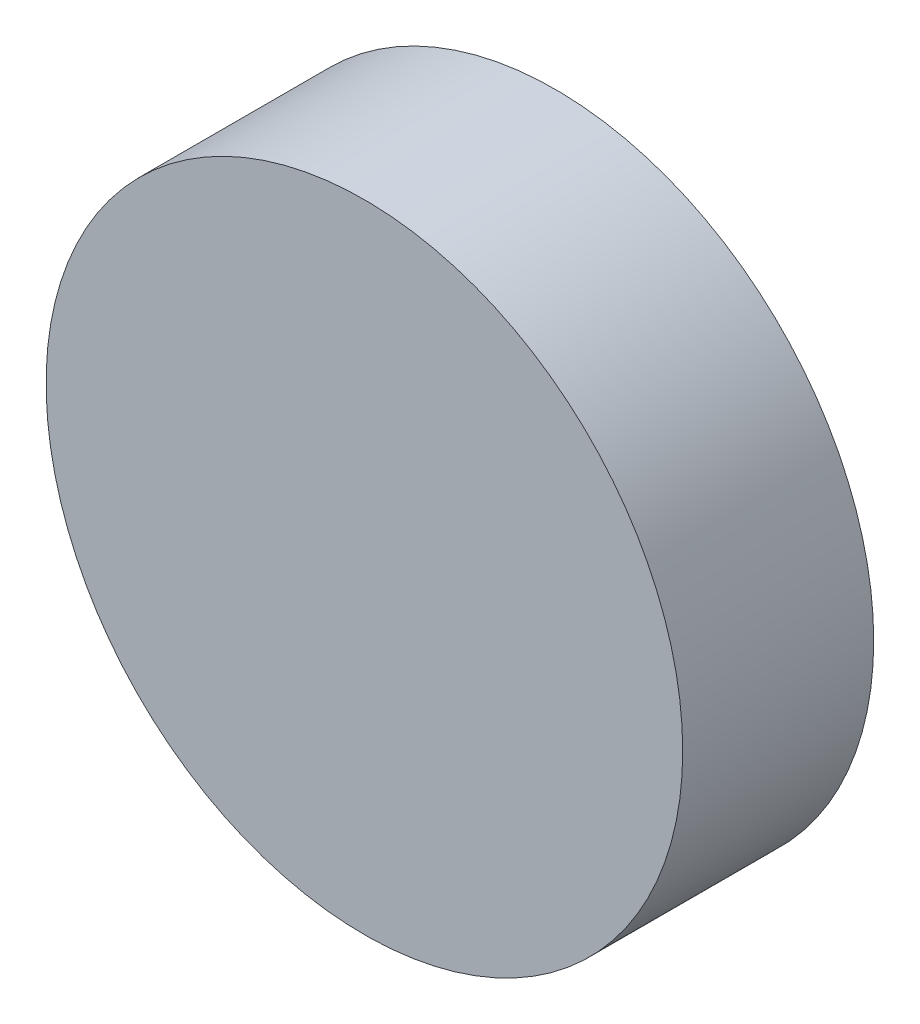
ISO-10303-21;
HEADER;
FILE_DESCRIPTION(('STEP AP214'),'2;1');
FILE_NAME('part.step','',(''),(''),'','','');
FILE_SCHEMA(('AUTOMOTIVE_DESIGN { 1 0 10303 214 1 1 1 1 }'));
ENDSEC;
DATA;
#1=APPLICATION_CONTEXT('core data for automotive mechanical design processes');
#2=APPLICATION_PROTOCOL_DEFINITION('international standard','automotive_design',2000,#1);
#3=PRODUCT_CONTEXT('',#1,'mechanical');
#4=PRODUCT('Part','Part','',(#3));
#5=PRODUCT_RELATED_PRODUCT_CATEGORY('part','',(#4));
#6=PRODUCT_DEFINITION_FORMATION('','',#4);
#7=PRODUCT_DEFINITION_CONTEXT('part definition',#1,'design');
#8=PRODUCT_DEFINITION('design','',#6,#7);
#9=PRODUCT_DEFINITION_SHAPE('','',#8);
#10=(LENGTH_UNIT() NAMED_UNIT(*) SI_UNIT(.MILLI.,.METRE.));
#11=(NAMED_UNIT(*) PLANE_ANGLE_UNIT() SI_UNIT($,.RADIAN.));
#12=(NAMED_UNIT(*) SI_UNIT($,.STERADIAN.) SOLID_ANGLE_UNIT());
#13=UNCERTAINTY_MEASURE_WITH_UNIT(LENGTH_MEASURE(1.E-05),#10,'distance_accuracy_value','');
#14=(GEOMETRIC_REPRESENTATION_CONTEXT(3) GLOBAL_UNCERTAINTY_ASSIGNED_CONTEXT((#13)) GLOBAL_UNIT_ASSIGNED_CONTEXT((#10,
#11,#12)) REPRESENTATION_CONTEXT('',''));
#15=CARTESIAN_POINT('',(0.,0.,0.));
#16=DIRECTION('',(0.,0.,1.));
#17=DIRECTION('',(1.,0.,0.));
#18=AXIS2_PLACEMENT_3D('',#15,#16,#17);
#19=CARTESIAN_POINT('',(0.,0.,28.575));
#20=DIRECTION('',(0.,0.,-1.));
#21=DIRECTION('',(-1.,0.,0.));
#22=AXIS2_PLACEMENT_3D('',#19,#20,#21);
#23=CYLINDRICAL_SURFACE('',#22,95.25);
#24=CARTESIAN_POINT('',(0.,0.,28.575));
#25=DIRECTION('',(0.,0.,1.));
#26=DIRECTION('',(1.,0.,0.));
#27=AXIS2_PLACEMENT_3D('',#24,#25,#26);
#28=CIRCLE('',#27,95.25);
#29=CARTESIAN_POINT('',(95.25,0.,28.575));
#30=VERTEX_POINT('',#29);
#31=EDGE_CURVE('E10',#30,#30,#28,.T.);
#32=ORIENTED_EDGE('',*,*,#31,.F.);
#33=EDGE_LOOP('',(#32));
#34=FACE_BOUND('',#33,.T.);
#35=CARTESIAN_POINT('',(0.,0.,-28.575));
#36=DIRECTION('',(0.,0.,1.));
#37=DIRECTION('',(1.,0.,0.));
#38=AXIS2_PLACEMENT_3D('',#35,#36,#37);
#39=CIRCLE('',#38,95.25);
#40=CARTESIAN_POINT('',(95.25,0.,-28.575));
#41=VERTEX_POINT('',#40);
#42=EDGE_CURVE('E46',#41,#41,#39,.T.);
#43=ORIENTED_EDGE('',*,*,#42,.T.);
#44=EDGE_LOOP('',(#43));
#45=FACE_BOUND('',#44,.T.);
#46=ADVANCED_FACE('F43',(#34,#45),#23,.T.);
#47=CARTESIAN_POINT('',(0.,0.,28.575));
#48=DIRECTION('',(0.,0.,1.));
#49=DIRECTION('',(1.,0.,0.));
#50=AXIS2_PLACEMENT_3D('',#47,#48,#49);
#51=PLANE('',#50);
#52=ORIENTED_EDGE('',*,*,#31,.T.);
#53=EDGE_LOOP('',(#52));
#54=FACE_BOUND('',#53,.T.);
#55=ADVANCED_FACE('F60',(#54),#51,.T.);
#56=CARTESIAN_POINT('',(0.,0.,-28.575));
#57=DIRECTION('',(0.,0.,1.));
#58=DIRECTION('',(1.,0.,0.));
#59=AXIS2_PLACEMENT_3D('',#56,#57,#58);
#60=PLANE('',#59);
#61=ORIENTED_EDGE('',*,*,#42,.F.);
#62=EDGE_LOOP('',(#61));
#63=FACE_BOUND('',#62,.T.);
#64=ADVANCED_FACE('F58',(#63),#60,.F.);
#65=CLOSED_SHELL('',(#46,#55,#64));
#66=MANIFOLD_SOLID_BREP('B2',#65);
#67=ADVANCED_BREP_SHAPE_REPRESENTATION('',(#18,#66),#14);
#68=SHAPE_DEFINITION_REPRESENTATION(#9,#67);
ENDSEC;
END-ISO-10303-21;
